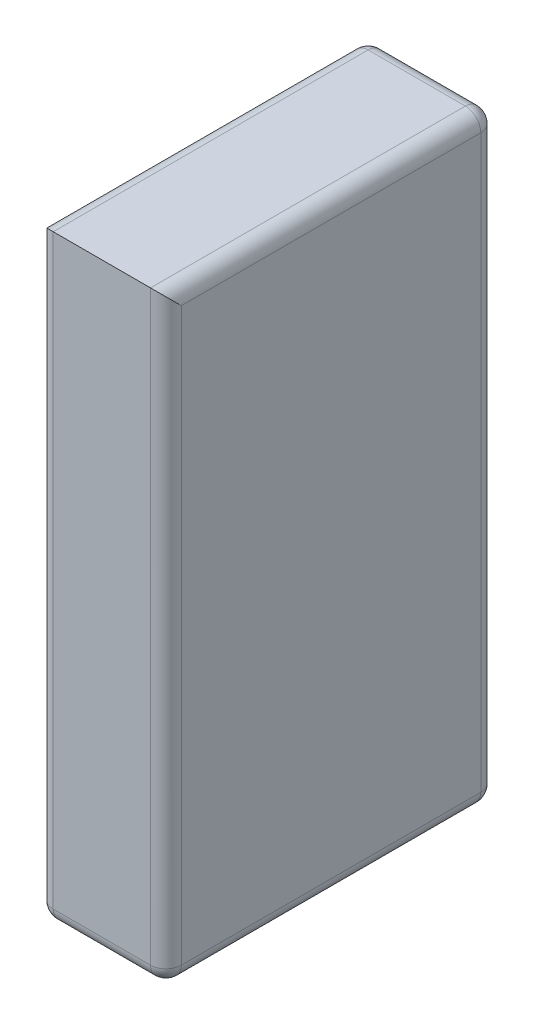
ISO-10303-21;
HEADER;
FILE_DESCRIPTION(('STEP AP214'),'2;1');
FILE_NAME('part.step','',(''),(''),'','','');
FILE_SCHEMA(('AUTOMOTIVE_DESIGN { 1 0 10303 214 1 1 1 1 }'));
ENDSEC;
DATA;
#1=APPLICATION_CONTEXT('core data for automotive mechanical design processes');
#2=APPLICATION_PROTOCOL_DEFINITION('international standard','automotive_design',2000,#1);
#3=PRODUCT_CONTEXT('',#1,'mechanical');
#4=PRODUCT('Part','Part','',(#3));
#5=PRODUCT_RELATED_PRODUCT_CATEGORY('part','',(#4));
#6=PRODUCT_DEFINITION_FORMATION('','',#4);
#7=PRODUCT_DEFINITION_CONTEXT('part definition',#1,'design');
#8=PRODUCT_DEFINITION('design','',#6,#7);
#9=PRODUCT_DEFINITION_SHAPE('','',#8);
#10=(LENGTH_UNIT() NAMED_UNIT(*) SI_UNIT(.MILLI.,.METRE.));
#11=(NAMED_UNIT(*) PLANE_ANGLE_UNIT() SI_UNIT($,.RADIAN.));
#12=(NAMED_UNIT(*) SI_UNIT($,.STERADIAN.) SOLID_ANGLE_UNIT());
#13=UNCERTAINTY_MEASURE_WITH_UNIT(LENGTH_MEASURE(1.E-05),#10,'distance_accuracy_value','');
#14=(GEOMETRIC_REPRESENTATION_CONTEXT(3) GLOBAL_UNCERTAINTY_ASSIGNED_CONTEXT((#13)) GLOBAL_UNIT_ASSIGNED_CONTEXT((#10,
#11,#12)) REPRESENTATION_CONTEXT('',''));
#15=CARTESIAN_POINT('',(0.,0.,0.));
#16=DIRECTION('',(0.,0.,1.));
#17=DIRECTION('',(1.,0.,0.));
#18=AXIS2_PLACEMENT_3D('',#15,#16,#17);
#19=CARTESIAN_POINT('',(16.6,0.,0.));
#20=DIRECTION('',(0.,1.,0.));
#21=DIRECTION('',(0.,0.,1.));
#22=AXIS2_PLACEMENT_3D('',#19,#20,#21);
#23=PLANE('',#22);
#24=DIRECTION('',(0.,0.,-1.));
#25=VECTOR('',#24,1.);
#26=CARTESIAN_POINT('',(2.,0.,0.));
#27=LINE('',#26,#25);
#28=CARTESIAN_POINT('',(2.,0.,40.8));
#29=VERTEX_POINT('',#28);
#30=CARTESIAN_POINT('',(2.,0.,2.));
#31=VERTEX_POINT('',#30);
#32=EDGE_CURVE('E193',#29,#31,#27,.T.);
#33=ORIENTED_EDGE('',*,*,#32,.T.);
#34=DIRECTION('',(-1.,0.,0.));
#35=VECTOR('',#34,1.);
#36=CARTESIAN_POINT('',(16.6,0.,2.));
#37=LINE('',#36,#35);
#38=CARTESIAN_POINT('',(14.6,0.,2.));
#39=VERTEX_POINT('',#38);
#40=EDGE_CURVE('E198',#31,#39,#37,.F.);
#41=ORIENTED_EDGE('',*,*,#40,.T.);
#42=DIRECTION('',(0.,0.,-1.));
#43=VECTOR('',#42,1.);
#44=CARTESIAN_POINT('',(14.6,0.,0.));
#45=LINE('',#44,#43);
#46=CARTESIAN_POINT('',(14.6,0.,40.8));
#47=VERTEX_POINT('',#46);
#48=EDGE_CURVE('E194',#39,#47,#45,.F.);
#49=ORIENTED_EDGE('',*,*,#48,.T.);
#50=DIRECTION('',(-1.,0.,0.));
#51=VECTOR('',#50,1.);
#52=CARTESIAN_POINT('',(16.6,0.,40.8));
#53=LINE('',#52,#51);
#54=EDGE_CURVE('E192',#47,#29,#53,.T.);
#55=ORIENTED_EDGE('',*,*,#54,.T.);
#56=EDGE_LOOP('',(#33,#41,#49,#55));
#57=FACE_BOUND('',#56,.T.);
#58=ADVANCED_FACE('F47',(#57),#23,.F.);
#59=CARTESIAN_POINT('',(16.6,0.,0.));
#60=DIRECTION('',(0.,0.,1.));
#61=DIRECTION('',(1.,0.,0.));
#62=AXIS2_PLACEMENT_3D('',#59,#60,#61);
#63=PLANE('',#62);
#64=DIRECTION('',(0.,1.,0.));
#65=VECTOR('',#64,1.);
#66=CARTESIAN_POINT('',(14.6,0.,0.));
#67=LINE('',#66,#65);
#68=CARTESIAN_POINT('',(14.6,76.,0.));
#69=VERTEX_POINT('',#68);
#70=CARTESIAN_POINT('',(14.6,2.,0.));
#71=VERTEX_POINT('',#70);
#72=EDGE_CURVE('E158',#69,#71,#67,.F.);
#73=ORIENTED_EDGE('',*,*,#72,.T.);
#74=DIRECTION('',(-1.,0.,0.));
#75=VECTOR('',#74,1.);
#76=CARTESIAN_POINT('',(16.6,2.,0.));
#77=LINE('',#76,#75);
#78=CARTESIAN_POINT('',(2.,2.,0.));
#79=VERTEX_POINT('',#78);
#80=EDGE_CURVE('E161',#71,#79,#77,.T.);
#81=ORIENTED_EDGE('',*,*,#80,.T.);
#82=DIRECTION('',(0.,1.,0.));
#83=VECTOR('',#82,1.);
#84=CARTESIAN_POINT('',(2.,78.,0.));
#85=LINE('',#84,#83);
#86=CARTESIAN_POINT('',(2.,76.,0.));
#87=VERTEX_POINT('',#86);
#88=EDGE_CURVE('E136',#79,#87,#85,.T.);
#89=ORIENTED_EDGE('',*,*,#88,.T.);
#90=DIRECTION('',(-1.,0.,0.));
#91=VECTOR('',#90,1.);
#92=CARTESIAN_POINT('',(16.6,76.,0.));
#93=LINE('',#92,#91);
#94=EDGE_CURVE('E154',#87,#69,#93,.F.);
#95=ORIENTED_EDGE('',*,*,#94,.T.);
#96=EDGE_LOOP('',(#73,#81,#89,#95));
#97=FACE_BOUND('',#96,.T.);
#98=ADVANCED_FACE('F163',(#97),#63,.F.);
#99=CARTESIAN_POINT('',(16.6,78.,0.));
#100=DIRECTION('',(0.,-1.,0.));
#101=DIRECTION('',(0.,0.,-1.));
#102=AXIS2_PLACEMENT_3D('',#99,#100,#101);
#103=PLANE('',#102);
#104=DIRECTION('',(-1.,0.,0.));
#105=VECTOR('',#104,1.);
#106=CARTESIAN_POINT('',(16.6,78.,2.));
#107=LINE('',#106,#105);
#108=CARTESIAN_POINT('',(14.6,78.,2.));
#109=VERTEX_POINT('',#108);
#110=CARTESIAN_POINT('',(2.,78.,2.));
#111=VERTEX_POINT('',#110);
#112=EDGE_CURVE('E178',#109,#111,#107,.T.);
#113=ORIENTED_EDGE('',*,*,#112,.T.);
#114=DIRECTION('',(0.,0.,1.));
#115=VECTOR('',#114,1.);
#116=CARTESIAN_POINT('',(2.,78.,42.8));
#117=LINE('',#116,#115);
#118=CARTESIAN_POINT('',(2.,78.,42.8));
#119=VERTEX_POINT('',#118);
#120=EDGE_CURVE('E185',#111,#119,#117,.T.);
#121=ORIENTED_EDGE('',*,*,#120,.T.);
#122=DIRECTION('',(-1.,0.,0.));
#123=VECTOR('',#122,1.);
#124=CARTESIAN_POINT('',(16.6,78.,42.8));
#125=LINE('',#124,#123);
#126=CARTESIAN_POINT('',(14.6,78.,42.8));
#127=VERTEX_POINT('',#126);
#128=EDGE_CURVE('E162',#127,#119,#125,.T.);
#129=ORIENTED_EDGE('',*,*,#128,.F.);
#130=DIRECTION('',(0.,0.,1.));
#131=VECTOR('',#130,1.);
#132=CARTESIAN_POINT('',(14.6,78.,0.));
#133=LINE('',#132,#131);
#134=EDGE_CURVE('E179',#127,#109,#133,.F.);
#135=ORIENTED_EDGE('',*,*,#134,.T.);
#136=EDGE_LOOP('',(#113,#121,#129,#135));
#137=FACE_BOUND('',#136,.T.);
#138=ADVANCED_FACE('F259',(#137),#103,.F.);
#139=CARTESIAN_POINT('',(16.6,0.,42.8));
#140=DIRECTION('',(0.,0.,-1.));
#141=DIRECTION('',(-1.,0.,0.));
#142=AXIS2_PLACEMENT_3D('',#139,#140,#141);
#143=PLANE('',#142);
#144=ORIENTED_EDGE('',*,*,#128,.T.);
#145=DIRECTION('',(0.,-1.,0.));
#146=VECTOR('',#145,1.);
#147=CARTESIAN_POINT('',(2.,0.,42.8));
#148=LINE('',#147,#146);
#149=CARTESIAN_POINT('',(2.,2.,42.8));
#150=VERTEX_POINT('',#149);
#151=EDGE_CURVE('E188',#119,#150,#148,.T.);
#152=ORIENTED_EDGE('',*,*,#151,.T.);
#153=DIRECTION('',(-1.,0.,0.));
#154=VECTOR('',#153,1.);
#155=CARTESIAN_POINT('',(16.6,2.,42.8));
#156=LINE('',#155,#154);
#157=CARTESIAN_POINT('',(14.6,2.,42.8));
#158=VERTEX_POINT('',#157);
#159=EDGE_CURVE('E184',#150,#158,#156,.F.);
#160=ORIENTED_EDGE('',*,*,#159,.T.);
#161=DIRECTION('',(0.,-1.,0.));
#162=VECTOR('',#161,1.);
#163=CARTESIAN_POINT('',(14.6,0.,42.8));
#164=LINE('',#163,#162);
#165=EDGE_CURVE('E190',#158,#127,#164,.F.);
#166=ORIENTED_EDGE('',*,*,#165,.T.);
#167=EDGE_LOOP('',(#144,#152,#160,#166));
#168=FACE_BOUND('',#167,.T.);
#169=ADVANCED_FACE('F258',(#168),#143,.F.);
#170=CARTESIAN_POINT('',(16.6,0.,0.));
#171=DIRECTION('',(-1.,0.,0.));
#172=DIRECTION('',(0.,0.,1.));
#173=AXIS2_PLACEMENT_3D('',#170,#171,#172);
#174=PLANE('',#173);
#175=DIRECTION('',(0.,0.,1.));
#176=VECTOR('',#175,1.);
#177=CARTESIAN_POINT('',(16.6,76.,0.));
#178=LINE('',#177,#176);
#179=CARTESIAN_POINT('',(16.6,76.,2.));
#180=VERTEX_POINT('',#179);
#181=CARTESIAN_POINT('',(16.6,76.,40.8));
#182=VERTEX_POINT('',#181);
#183=EDGE_CURVE('E59',#180,#182,#178,.T.);
#184=ORIENTED_EDGE('',*,*,#183,.T.);
#185=DIRECTION('',(0.,-1.,0.));
#186=VECTOR('',#185,1.);
#187=CARTESIAN_POINT('',(16.6,0.,40.8));
#188=LINE('',#187,#186);
#189=CARTESIAN_POINT('',(16.6,2.,40.8));
#190=VERTEX_POINT('',#189);
#191=EDGE_CURVE('E11',#182,#190,#188,.T.);
#192=ORIENTED_EDGE('',*,*,#191,.T.);
#193=DIRECTION('',(0.,0.,-1.));
#194=VECTOR('',#193,1.);
#195=CARTESIAN_POINT('',(16.6,2.,0.));
#196=LINE('',#195,#194);
#197=CARTESIAN_POINT('',(16.6,2.,2.));
#198=VERTEX_POINT('',#197);
#199=EDGE_CURVE('E196',#190,#198,#196,.T.);
#200=ORIENTED_EDGE('',*,*,#199,.T.);
#201=DIRECTION('',(0.,1.,0.));
#202=VECTOR('',#201,1.);
#203=CARTESIAN_POINT('',(16.6,0.,2.));
#204=LINE('',#203,#202);
#205=EDGE_CURVE('E69',#198,#180,#204,.T.);
#206=ORIENTED_EDGE('',*,*,#205,.T.);
#207=EDGE_LOOP('',(#184,#192,#200,#206));
#208=FACE_BOUND('',#207,.T.);
#209=ADVANCED_FACE('F298',(#208),#174,.F.);
#210=CARTESIAN_POINT('',(0.,0.,0.));
#211=DIRECTION('',(-1.,0.,0.));
#212=DIRECTION('',(0.,0.,1.));
#213=AXIS2_PLACEMENT_3D('',#210,#211,#212);
#214=PLANE('',#213);
#215=DIRECTION('',(0.,0.,1.));
#216=VECTOR('',#215,1.);
#217=CARTESIAN_POINT('',(0.,76.,0.));
#218=LINE('',#217,#216);
#219=CARTESIAN_POINT('',(0.,76.,40.8));
#220=VERTEX_POINT('',#219);
#221=CARTESIAN_POINT('',(0.,76.,2.));
#222=VERTEX_POINT('',#221);
#223=EDGE_CURVE('E172',#220,#222,#218,.F.);
#224=ORIENTED_EDGE('',*,*,#223,.T.);
#225=DIRECTION('',(0.,1.,0.));
#226=VECTOR('',#225,1.);
#227=CARTESIAN_POINT('',(0.,0.,2.));
#228=LINE('',#227,#226);
#229=CARTESIAN_POINT('',(0.,2.,2.));
#230=VERTEX_POINT('',#229);
#231=EDGE_CURVE('E138',#222,#230,#228,.F.);
#232=ORIENTED_EDGE('',*,*,#231,.T.);
#233=DIRECTION('',(0.,0.,-1.));
#234=VECTOR('',#233,1.);
#235=CARTESIAN_POINT('',(0.,2.,42.8));
#236=LINE('',#235,#234);
#237=CARTESIAN_POINT('',(0.,2.,40.8));
#238=VERTEX_POINT('',#237);
#239=EDGE_CURVE('E166',#230,#238,#236,.F.);
#240=ORIENTED_EDGE('',*,*,#239,.T.);
#241=DIRECTION('',(0.,-1.,0.));
#242=VECTOR('',#241,1.);
#243=CARTESIAN_POINT('',(0.,78.,40.8));
#244=LINE('',#243,#242);
#245=EDGE_CURVE('E171',#238,#220,#244,.F.);
#246=ORIENTED_EDGE('',*,*,#245,.T.);
#247=EDGE_LOOP('',(#224,#232,#240,#246));
#248=FACE_BOUND('',#247,.T.);
#249=ADVANCED_FACE('F291',(#248),#214,.T.);
#250=CARTESIAN_POINT('',(14.6,2.,40.8));
#251=DIRECTION('',(0.,0.,1.));
#252=DIRECTION('',(1.,0.,0.));
#253=AXIS2_PLACEMENT_3D('',#250,#251,#252);
#254=SPHERICAL_SURFACE('',#253,2.);
#255=CARTESIAN_POINT('',(14.6,2.,40.8));
#256=DIRECTION('',(0.,0.,1.));
#257=DIRECTION('',(1.,0.,0.));
#258=AXIS2_PLACEMENT_3D('',#255,#256,#257);
#259=CIRCLE('',#258,2.);
#260=EDGE_CURVE('E238',#190,#47,#259,.F.);
#261=ORIENTED_EDGE('',*,*,#260,.F.);
#262=CARTESIAN_POINT('',(14.6,2.,40.8));
#263=DIRECTION('',(0.,-1.,0.));
#264=DIRECTION('',(0.,0.,-1.));
#265=AXIS2_PLACEMENT_3D('',#262,#263,#264);
#266=CIRCLE('',#265,2.);
#267=EDGE_CURVE('E52',#158,#190,#266,.F.);
#268=ORIENTED_EDGE('',*,*,#267,.F.);
#269=CARTESIAN_POINT('',(14.6,2.,40.8));
#270=DIRECTION('',(1.,0.,0.));
#271=DIRECTION('',(0.,0.,-1.));
#272=AXIS2_PLACEMENT_3D('',#269,#270,#271);
#273=CIRCLE('',#272,2.);
#274=EDGE_CURVE('E245',#47,#158,#273,.F.);
#275=ORIENTED_EDGE('',*,*,#274,.F.);
#276=EDGE_LOOP('',(#261,#268,#275));
#277=FACE_BOUND('',#276,.T.);
#278=ADVANCED_FACE('F51',(#277),#254,.T.);
#279=CARTESIAN_POINT('',(14.6,0.,40.8));
#280=DIRECTION('',(0.,-1.,0.));
#281=DIRECTION('',(0.,0.,-1.));
#282=AXIS2_PLACEMENT_3D('',#279,#280,#281);
#283=CYLINDRICAL_SURFACE('',#282,2.);
#284=ORIENTED_EDGE('',*,*,#267,.T.);
#285=ORIENTED_EDGE('',*,*,#191,.F.);
#286=CARTESIAN_POINT('',(14.6,76.,40.8));
#287=DIRECTION('',(0.,-0.707106781186547,0.707106781186547));
#288=DIRECTION('',(0.,0.707106781186547,0.707106781186547));
#289=AXIS2_PLACEMENT_3D('',#286,#287,#288);
#290=ELLIPSE('',#289,2.82842712474619,2.);
#291=EDGE_CURVE('E240',#127,#182,#290,.F.);
#292=ORIENTED_EDGE('',*,*,#291,.F.);
#293=ORIENTED_EDGE('',*,*,#165,.F.);
#294=EDGE_LOOP('',(#284,#285,#292,#293));
#295=FACE_BOUND('',#294,.T.);
#296=ADVANCED_FACE('F264',(#295),#283,.T.);
#297=CARTESIAN_POINT('',(16.6,2.,40.8));
#298=DIRECTION('',(-1.,0.,0.));
#299=DIRECTION('',(0.,0.,1.));
#300=AXIS2_PLACEMENT_3D('',#297,#298,#299);
#301=CYLINDRICAL_SURFACE('',#300,2.);
#302=ORIENTED_EDGE('',*,*,#274,.T.);
#303=ORIENTED_EDGE('',*,*,#159,.F.);
#304=CARTESIAN_POINT('',(2.,2.,40.8));
#305=DIRECTION('',(-1.,0.,0.));
#306=DIRECTION('',(0.,0.,1.));
#307=AXIS2_PLACEMENT_3D('',#304,#305,#306);
#308=CIRCLE('',#307,2.);
#309=EDGE_CURVE('E233',#29,#150,#308,.T.);
#310=ORIENTED_EDGE('',*,*,#309,.F.);
#311=ORIENTED_EDGE('',*,*,#54,.F.);
#312=EDGE_LOOP('',(#302,#303,#310,#311));
#313=FACE_BOUND('',#312,.T.);
#314=ADVANCED_FACE('F284',(#313),#301,.T.);
#315=CARTESIAN_POINT('',(14.6,2.,0.));
#316=DIRECTION('',(0.,0.,-1.));
#317=DIRECTION('',(-1.,0.,0.));
#318=AXIS2_PLACEMENT_3D('',#315,#316,#317);
#319=CYLINDRICAL_SURFACE('',#318,2.);
#320=ORIENTED_EDGE('',*,*,#260,.T.);
#321=ORIENTED_EDGE('',*,*,#48,.F.);
#322=CARTESIAN_POINT('',(14.6,2.,2.));
#323=DIRECTION('',(0.,0.,-1.));
#324=DIRECTION('',(-1.,0.,0.));
#325=AXIS2_PLACEMENT_3D('',#322,#323,#324);
#326=CIRCLE('',#325,2.);
#327=EDGE_CURVE('E231',#198,#39,#326,.T.);
#328=ORIENTED_EDGE('',*,*,#327,.F.);
#329=ORIENTED_EDGE('',*,*,#199,.F.);
#330=EDGE_LOOP('',(#320,#321,#328,#329));
#331=FACE_BOUND('',#330,.T.);
#332=ADVANCED_FACE('F286',(#331),#319,.T.);
#333=CARTESIAN_POINT('',(14.6,0.,2.));
#334=DIRECTION('',(0.,1.,0.));
#335=DIRECTION('',(0.,0.,1.));
#336=AXIS2_PLACEMENT_3D('',#333,#334,#335);
#337=CYLINDRICAL_SURFACE('',#336,2.);
#338=CARTESIAN_POINT('',(14.6,76.,2.));
#339=DIRECTION('',(0.,1.,0.));
#340=DIRECTION('',(0.,0.,1.));
#341=AXIS2_PLACEMENT_3D('',#338,#339,#340);
#342=CIRCLE('',#341,2.);
#343=EDGE_CURVE('E224',#180,#69,#342,.T.);
#344=ORIENTED_EDGE('',*,*,#343,.F.);
#345=ORIENTED_EDGE('',*,*,#205,.F.);
#346=CARTESIAN_POINT('',(14.6,2.,2.));
#347=DIRECTION('',(0.,-1.,0.));
#348=DIRECTION('',(1.,0.,0.));
#349=AXIS2_PLACEMENT_3D('',#346,#347,#348);
#350=CIRCLE('',#349,2.);
#351=EDGE_CURVE('E228',#71,#198,#350,.T.);
#352=ORIENTED_EDGE('',*,*,#351,.F.);
#353=ORIENTED_EDGE('',*,*,#72,.F.);
#354=EDGE_LOOP('',(#344,#345,#352,#353));
#355=FACE_BOUND('',#354,.T.);
#356=ADVANCED_FACE('F342',(#355),#337,.T.);
#357=CARTESIAN_POINT('',(14.6,76.,0.));
#358=DIRECTION('',(0.,0.,1.));
#359=DIRECTION('',(1.,0.,0.));
#360=AXIS2_PLACEMENT_3D('',#357,#358,#359);
#361=CYLINDRICAL_SURFACE('',#360,2.);
#362=ORIENTED_EDGE('',*,*,#291,.T.);
#363=ORIENTED_EDGE('',*,*,#183,.F.);
#364=CARTESIAN_POINT('',(14.6,76.,2.));
#365=DIRECTION('',(0.,0.,-1.));
#366=DIRECTION('',(-1.,0.,0.));
#367=AXIS2_PLACEMENT_3D('',#364,#365,#366);
#368=CIRCLE('',#367,2.);
#369=EDGE_CURVE('E225',#109,#180,#368,.T.);
#370=ORIENTED_EDGE('',*,*,#369,.F.);
#371=ORIENTED_EDGE('',*,*,#134,.F.);
#372=EDGE_LOOP('',(#362,#363,#370,#371));
#373=FACE_BOUND('',#372,.T.);
#374=ADVANCED_FACE('F266',(#373),#361,.T.);
#375=CARTESIAN_POINT('',(2.,2.,40.8));
#376=DIRECTION('',(0.,0.,1.));
#377=DIRECTION('',(1.,0.,0.));
#378=AXIS2_PLACEMENT_3D('',#375,#376,#377);
#379=SPHERICAL_SURFACE('',#378,2.);
#380=CARTESIAN_POINT('',(2.,2.,40.8));
#381=DIRECTION('',(0.,0.,1.));
#382=DIRECTION('',(0.,-1.,0.));
#383=AXIS2_PLACEMENT_3D('',#380,#381,#382);
#384=CIRCLE('',#383,2.);
#385=EDGE_CURVE('E218',#29,#238,#384,.F.);
#386=ORIENTED_EDGE('',*,*,#385,.F.);
#387=ORIENTED_EDGE('',*,*,#309,.T.);
#388=CARTESIAN_POINT('',(2.,2.,40.8));
#389=DIRECTION('',(0.,-1.,0.));
#390=DIRECTION('',(0.,0.,-1.));
#391=AXIS2_PLACEMENT_3D('',#388,#389,#390);
#392=CIRCLE('',#391,2.);
#393=EDGE_CURVE('E219',#238,#150,#392,.F.);
#394=ORIENTED_EDGE('',*,*,#393,.F.);
#395=EDGE_LOOP('',(#386,#387,#394));
#396=FACE_BOUND('',#395,.T.);
#397=ADVANCED_FACE('F279',(#396),#379,.T.);
#398=CARTESIAN_POINT('',(14.6,2.,2.));
#399=DIRECTION('',(1.,0.,0.));
#400=DIRECTION('',(0.,0.,-1.));
#401=AXIS2_PLACEMENT_3D('',#398,#399,#400);
#402=SPHERICAL_SURFACE('',#401,2.);
#403=ORIENTED_EDGE('',*,*,#351,.T.);
#404=ORIENTED_EDGE('',*,*,#327,.T.);
#405=CARTESIAN_POINT('',(14.6,2.,2.));
#406=DIRECTION('',(1.,0.,0.));
#407=DIRECTION('',(0.,0.,-1.));
#408=AXIS2_PLACEMENT_3D('',#405,#406,#407);
#409=CIRCLE('',#408,2.);
#410=EDGE_CURVE('E211',#71,#39,#409,.F.);
#411=ORIENTED_EDGE('',*,*,#410,.F.);
#412=EDGE_LOOP('',(#403,#404,#411));
#413=FACE_BOUND('',#412,.T.);
#414=ADVANCED_FACE('F333',(#413),#402,.T.);
#415=CARTESIAN_POINT('',(14.6,76.,2.));
#416=DIRECTION('',(1.,0.,0.));
#417=DIRECTION('',(0.,0.,-1.));
#418=AXIS2_PLACEMENT_3D('',#415,#416,#417);
#419=SPHERICAL_SURFACE('',#418,2.);
#420=ORIENTED_EDGE('',*,*,#369,.T.);
#421=ORIENTED_EDGE('',*,*,#343,.T.);
#422=CARTESIAN_POINT('',(14.6,76.,2.));
#423=DIRECTION('',(1.,0.,0.));
#424=DIRECTION('',(0.,0.,-1.));
#425=AXIS2_PLACEMENT_3D('',#422,#423,#424);
#426=CIRCLE('',#425,2.);
#427=EDGE_CURVE('E160',#109,#69,#426,.F.);
#428=ORIENTED_EDGE('',*,*,#427,.F.);
#429=EDGE_LOOP('',(#420,#421,#428));
#430=FACE_BOUND('',#429,.T.);
#431=ADVANCED_FACE('F267',(#430),#419,.T.);
#432=CARTESIAN_POINT('',(2.,0.,40.8));
#433=DIRECTION('',(0.,1.,0.));
#434=DIRECTION('',(0.,0.,1.));
#435=AXIS2_PLACEMENT_3D('',#432,#433,#434);
#436=CYLINDRICAL_SURFACE('',#435,2.);
#437=ORIENTED_EDGE('',*,*,#393,.T.);
#438=ORIENTED_EDGE('',*,*,#151,.F.);
#439=CARTESIAN_POINT('',(2.,76.,40.8));
#440=DIRECTION('',(0.,0.707106781186547,-0.707106781186547));
#441=DIRECTION('',(0.,0.707106781186547,0.707106781186547));
#442=AXIS2_PLACEMENT_3D('',#439,#440,#441);
#443=ELLIPSE('',#442,2.82842712474619,2.);
#444=EDGE_CURVE('E206',#220,#119,#443,.T.);
#445=ORIENTED_EDGE('',*,*,#444,.F.);
#446=ORIENTED_EDGE('',*,*,#245,.F.);
#447=EDGE_LOOP('',(#437,#438,#445,#446));
#448=FACE_BOUND('',#447,.T.);
#449=ADVANCED_FACE('F276',(#448),#436,.T.);
#450=CARTESIAN_POINT('',(2.,2.,0.));
#451=DIRECTION('',(0.,0.,1.));
#452=DIRECTION('',(1.,0.,0.));
#453=AXIS2_PLACEMENT_3D('',#450,#451,#452);
#454=CYLINDRICAL_SURFACE('',#453,2.);
#455=ORIENTED_EDGE('',*,*,#385,.T.);
#456=ORIENTED_EDGE('',*,*,#239,.F.);
#457=CARTESIAN_POINT('',(2.,2.,2.));
#458=DIRECTION('',(0.,0.,-1.));
#459=DIRECTION('',(-1.,0.,0.));
#460=AXIS2_PLACEMENT_3D('',#457,#458,#459);
#461=CIRCLE('',#460,2.);
#462=EDGE_CURVE('E210',#31,#230,#461,.T.);
#463=ORIENTED_EDGE('',*,*,#462,.F.);
#464=ORIENTED_EDGE('',*,*,#32,.F.);
#465=EDGE_LOOP('',(#455,#456,#463,#464));
#466=FACE_BOUND('',#465,.T.);
#467=ADVANCED_FACE('F323',(#466),#454,.T.);
#468=CARTESIAN_POINT('',(16.6,2.,2.));
#469=DIRECTION('',(-1.,0.,0.));
#470=DIRECTION('',(0.,0.,1.));
#471=AXIS2_PLACEMENT_3D('',#468,#469,#470);
#472=CYLINDRICAL_SURFACE('',#471,2.);
#473=ORIENTED_EDGE('',*,*,#410,.T.);
#474=ORIENTED_EDGE('',*,*,#40,.F.);
#475=CARTESIAN_POINT('',(2.,2.,2.));
#476=DIRECTION('',(-1.,0.,0.));
#477=DIRECTION('',(0.,0.,1.));
#478=AXIS2_PLACEMENT_3D('',#475,#476,#477);
#479=CIRCLE('',#478,2.);
#480=EDGE_CURVE('E152',#79,#31,#479,.T.);
#481=ORIENTED_EDGE('',*,*,#480,.F.);
#482=ORIENTED_EDGE('',*,*,#80,.F.);
#483=EDGE_LOOP('',(#473,#474,#481,#482));
#484=FACE_BOUND('',#483,.T.);
#485=ADVANCED_FACE('F321',(#484),#472,.T.);
#486=CARTESIAN_POINT('',(16.6,76.,2.));
#487=DIRECTION('',(-1.,0.,0.));
#488=DIRECTION('',(0.,0.,1.));
#489=AXIS2_PLACEMENT_3D('',#486,#487,#488);
#490=CYLINDRICAL_SURFACE('',#489,2.);
#491=ORIENTED_EDGE('',*,*,#427,.T.);
#492=ORIENTED_EDGE('',*,*,#94,.F.);
#493=CARTESIAN_POINT('',(2.,76.,2.));
#494=DIRECTION('',(-1.,0.,0.));
#495=DIRECTION('',(0.,0.,1.));
#496=AXIS2_PLACEMENT_3D('',#493,#494,#495);
#497=CIRCLE('',#496,2.);
#498=EDGE_CURVE('E143',#111,#87,#497,.T.);
#499=ORIENTED_EDGE('',*,*,#498,.F.);
#500=ORIENTED_EDGE('',*,*,#112,.F.);
#501=EDGE_LOOP('',(#491,#492,#499,#500));
#502=FACE_BOUND('',#501,.T.);
#503=ADVANCED_FACE('F151',(#502),#490,.T.);
#504=CARTESIAN_POINT('',(2.,76.,0.));
#505=DIRECTION('',(0.,0.,-1.));
#506=DIRECTION('',(-1.,0.,0.));
#507=AXIS2_PLACEMENT_3D('',#504,#505,#506);
#508=CYLINDRICAL_SURFACE('',#507,2.);
#509=ORIENTED_EDGE('',*,*,#444,.T.);
#510=ORIENTED_EDGE('',*,*,#120,.F.);
#511=CARTESIAN_POINT('',(2.,76.,2.));
#512=DIRECTION('',(0.,0.,-1.));
#513=DIRECTION('',(0.,1.,0.));
#514=AXIS2_PLACEMENT_3D('',#511,#512,#513);
#515=CIRCLE('',#514,2.);
#516=EDGE_CURVE('E149',#222,#111,#515,.T.);
#517=ORIENTED_EDGE('',*,*,#516,.F.);
#518=ORIENTED_EDGE('',*,*,#223,.F.);
#519=EDGE_LOOP('',(#509,#510,#517,#518));
#520=FACE_BOUND('',#519,.T.);
#521=ADVANCED_FACE('F271',(#520),#508,.T.);
#522=CARTESIAN_POINT('',(2.,2.,2.));
#523=DIRECTION('',(0.,-1.,0.));
#524=DIRECTION('',(0.,0.,-1.));
#525=AXIS2_PLACEMENT_3D('',#522,#523,#524);
#526=SPHERICAL_SURFACE('',#525,2.);
#527=ORIENTED_EDGE('',*,*,#480,.T.);
#528=ORIENTED_EDGE('',*,*,#462,.T.);
#529=CARTESIAN_POINT('',(2.,2.,2.));
#530=DIRECTION('',(0.,-1.,0.));
#531=DIRECTION('',(0.,0.,-1.));
#532=AXIS2_PLACEMENT_3D('',#529,#530,#531);
#533=CIRCLE('',#532,2.);
#534=EDGE_CURVE('E141',#79,#230,#533,.F.);
#535=ORIENTED_EDGE('',*,*,#534,.F.);
#536=EDGE_LOOP('',(#527,#528,#535));
#537=FACE_BOUND('',#536,.T.);
#538=ADVANCED_FACE('F313',(#537),#526,.T.);
#539=CARTESIAN_POINT('',(2.,76.,2.));
#540=DIRECTION('',(0.,1.,0.));
#541=DIRECTION('',(0.,0.,1.));
#542=AXIS2_PLACEMENT_3D('',#539,#540,#541);
#543=SPHERICAL_SURFACE('',#542,2.);
#544=ORIENTED_EDGE('',*,*,#516,.T.);
#545=ORIENTED_EDGE('',*,*,#498,.T.);
#546=CARTESIAN_POINT('',(2.,76.,2.));
#547=DIRECTION('',(0.,1.,0.));
#548=DIRECTION('',(0.,0.,1.));
#549=AXIS2_PLACEMENT_3D('',#546,#547,#548);
#550=CIRCLE('',#549,2.);
#551=EDGE_CURVE('E135',#222,#87,#550,.F.);
#552=ORIENTED_EDGE('',*,*,#551,.F.);
#553=EDGE_LOOP('',(#544,#545,#552));
#554=FACE_BOUND('',#553,.T.);
#555=ADVANCED_FACE('F147',(#554),#543,.T.);
#556=CARTESIAN_POINT('',(2.,0.,2.));
#557=DIRECTION('',(0.,-1.,0.));
#558=DIRECTION('',(0.,0.,-1.));
#559=AXIS2_PLACEMENT_3D('',#556,#557,#558);
#560=CYLINDRICAL_SURFACE('',#559,2.);
#561=ORIENTED_EDGE('',*,*,#534,.T.);
#562=ORIENTED_EDGE('',*,*,#231,.F.);
#563=ORIENTED_EDGE('',*,*,#551,.T.);
#564=ORIENTED_EDGE('',*,*,#88,.F.);
#565=EDGE_LOOP('',(#561,#562,#563,#564));
#566=FACE_BOUND('',#565,.T.);
#567=ADVANCED_FACE('F132',(#566),#560,.T.);
#568=CLOSED_SHELL('',(#58,#98,#138,#169,#209,#249,#278,#296,#314,#332,#356,#374,#397,#414,#431,
#449,#467,#485,#503,#521,#538,#555,#567));
#569=MANIFOLD_SOLID_BREP('B2',#568);
#570=ADVANCED_BREP_SHAPE_REPRESENTATION('',(#18,#569),#14);
#571=SHAPE_DEFINITION_REPRESENTATION(#9,#570);
ENDSEC;
END-ISO-10303-21;
